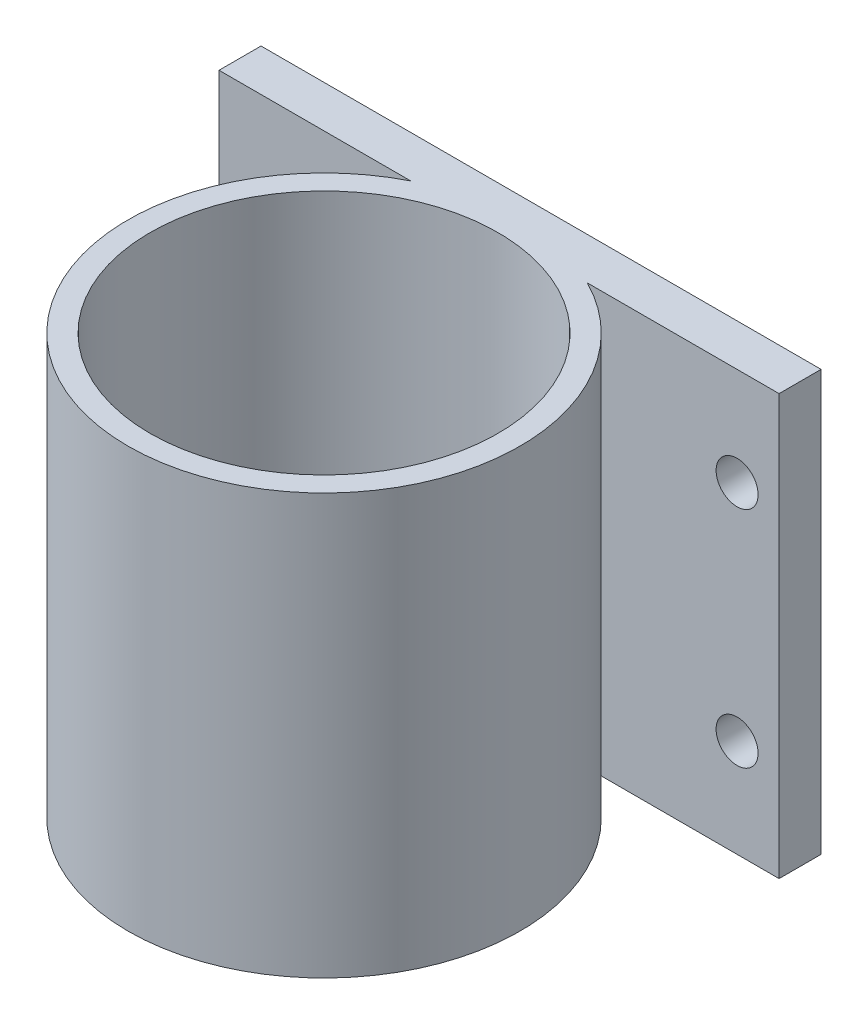
ISO-10303-21;
HEADER;
FILE_DESCRIPTION(('STEP AP214'),'2;1');
FILE_NAME('part.step','',(''),(''),'','','');
FILE_SCHEMA(('AUTOMOTIVE_DESIGN { 1 0 10303 214 1 1 1 1 }'));
ENDSEC;
DATA;
#1=APPLICATION_CONTEXT('core data for automotive mechanical design processes');
#2=APPLICATION_PROTOCOL_DEFINITION('international standard','automotive_design',2000,#1);
#3=PRODUCT_CONTEXT('',#1,'mechanical');
#4=PRODUCT('Part','Part','',(#3));
#5=PRODUCT_RELATED_PRODUCT_CATEGORY('part','',(#4));
#6=PRODUCT_DEFINITION_FORMATION('','',#4);
#7=PRODUCT_DEFINITION_CONTEXT('part definition',#1,'design');
#8=PRODUCT_DEFINITION('design','',#6,#7);
#9=PRODUCT_DEFINITION_SHAPE('','',#8);
#10=(LENGTH_UNIT() NAMED_UNIT(*) SI_UNIT(.MILLI.,.METRE.));
#11=(NAMED_UNIT(*) PLANE_ANGLE_UNIT() SI_UNIT($,.RADIAN.));
#12=(NAMED_UNIT(*) SI_UNIT($,.STERADIAN.) SOLID_ANGLE_UNIT());
#13=UNCERTAINTY_MEASURE_WITH_UNIT(LENGTH_MEASURE(1.E-05),#10,'distance_accuracy_value','');
#14=(GEOMETRIC_REPRESENTATION_CONTEXT(3) GLOBAL_UNCERTAINTY_ASSIGNED_CONTEXT((#13)) GLOBAL_UNIT_ASSIGNED_CONTEXT((#10,
#11,#12)) REPRESENTATION_CONTEXT('',''));
#15=CARTESIAN_POINT('',(0.,0.,0.));
#16=DIRECTION('',(0.,0.,1.));
#17=DIRECTION('',(1.,0.,0.));
#18=AXIS2_PLACEMENT_3D('',#15,#16,#17);
#19=CARTESIAN_POINT('',(0.,30.,0.));
#20=DIRECTION('',(0.,1.,0.));
#21=DIRECTION('',(0.,0.,1.));
#22=AXIS2_PLACEMENT_3D('',#19,#20,#21);
#23=PLANE('',#22);
#24=CARTESIAN_POINT('',(0.,30.,0.));
#25=DIRECTION('',(0.,1.,0.));
#26=DIRECTION('',(0.,0.,1.));
#27=AXIS2_PLACEMENT_3D('',#24,#25,#26);
#28=CIRCLE('',#27,14.);
#29=CARTESIAN_POINT('',(-6.30476010645924,30.,-12.5));
#30=VERTEX_POINT('',#29);
#31=CARTESIAN_POINT('',(6.30476010645924,30.,-12.5));
#32=VERTEX_POINT('',#31);
#33=EDGE_CURVE('E59',#30,#32,#28,.T.);
#34=ORIENTED_EDGE('',*,*,#33,.T.);
#35=DIRECTION('',(-1.,0.,0.));
#36=VECTOR('',#35,1.);
#37=CARTESIAN_POINT('',(-20.,30.,-12.5));
#38=LINE('',#37,#36);
#39=CARTESIAN_POINT('',(20.,30.,-12.5));
#40=VERTEX_POINT('',#39);
#41=EDGE_CURVE('E94',#40,#32,#38,.T.);
#42=ORIENTED_EDGE('',*,*,#41,.F.);
#43=DIRECTION('',(0.,0.,1.));
#44=VECTOR('',#43,1.);
#45=CARTESIAN_POINT('',(20.,30.,-12.5));
#46=LINE('',#45,#44);
#47=CARTESIAN_POINT('',(20.,30.,-15.5));
#48=VERTEX_POINT('',#47);
#49=EDGE_CURVE('E108',#48,#40,#46,.T.);
#50=ORIENTED_EDGE('',*,*,#49,.F.);
#51=DIRECTION('',(1.,0.,0.));
#52=VECTOR('',#51,1.);
#53=CARTESIAN_POINT('',(-20.,30.,-15.5));
#54=LINE('',#53,#52);
#55=CARTESIAN_POINT('',(-20.,30.,-15.5));
#56=VERTEX_POINT('',#55);
#57=EDGE_CURVE('E102',#56,#48,#54,.T.);
#58=ORIENTED_EDGE('',*,*,#57,.F.);
#59=DIRECTION('',(0.,0.,-1.));
#60=VECTOR('',#59,1.);
#61=CARTESIAN_POINT('',(-20.,30.,-12.5));
#62=LINE('',#61,#60);
#63=CARTESIAN_POINT('',(-20.,30.,-12.5));
#64=VERTEX_POINT('',#63);
#65=EDGE_CURVE('E111',#64,#56,#62,.T.);
#66=ORIENTED_EDGE('',*,*,#65,.F.);
#67=EDGE_CURVE('E112',#30,#64,#38,.T.);
#68=ORIENTED_EDGE('',*,*,#67,.F.);
#69=EDGE_LOOP('',(#34,#42,#50,#58,#66,#68));
#70=FACE_BOUND('',#69,.T.);
#71=CARTESIAN_POINT('',(0.,30.,0.));
#72=DIRECTION('',(0.,1.,0.));
#73=DIRECTION('',(0.,0.,1.));
#74=AXIS2_PLACEMENT_3D('',#71,#72,#73);
#75=CIRCLE('',#74,12.425);
#76=CARTESIAN_POINT('',(0.,30.,12.425));
#77=VERTEX_POINT('',#76);
#78=EDGE_CURVE('E140',#77,#77,#75,.T.);
#79=ORIENTED_EDGE('',*,*,#78,.F.);
#80=EDGE_LOOP('',(#79));
#81=FACE_BOUND('',#80,.T.);
#82=ADVANCED_FACE('F38',(#70,#81),#23,.T.);
#83=CARTESIAN_POINT('',(0.,0.,0.));
#84=DIRECTION('',(0.,1.,0.));
#85=DIRECTION('',(0.,0.,1.));
#86=AXIS2_PLACEMENT_3D('',#83,#84,#85);
#87=PLANE('',#86);
#88=CARTESIAN_POINT('',(0.,0.,0.));
#89=DIRECTION('',(0.,1.,0.));
#90=DIRECTION('',(0.,0.,1.));
#91=AXIS2_PLACEMENT_3D('',#88,#89,#90);
#92=CIRCLE('',#91,14.);
#93=CARTESIAN_POINT('',(-6.30476010645924,0.,-12.5));
#94=VERTEX_POINT('',#93);
#95=CARTESIAN_POINT('',(6.30476010645924,0.,-12.5));
#96=VERTEX_POINT('',#95);
#97=EDGE_CURVE('E54',#94,#96,#92,.T.);
#98=ORIENTED_EDGE('',*,*,#97,.F.);
#99=DIRECTION('',(-1.,0.,0.));
#100=VECTOR('',#99,1.);
#101=CARTESIAN_POINT('',(-20.,0.,-12.5));
#102=LINE('',#101,#100);
#103=CARTESIAN_POINT('',(-20.,0.,-12.5));
#104=VERTEX_POINT('',#103);
#105=EDGE_CURVE('E130',#94,#104,#102,.T.);
#106=ORIENTED_EDGE('',*,*,#105,.T.);
#107=DIRECTION('',(0.,0.,-1.));
#108=VECTOR('',#107,1.);
#109=CARTESIAN_POINT('',(-20.,0.,-12.5));
#110=LINE('',#109,#108);
#111=CARTESIAN_POINT('',(-20.,0.,-15.5));
#112=VERTEX_POINT('',#111);
#113=EDGE_CURVE('E119',#104,#112,#110,.T.);
#114=ORIENTED_EDGE('',*,*,#113,.T.);
#115=DIRECTION('',(1.,0.,0.));
#116=VECTOR('',#115,1.);
#117=CARTESIAN_POINT('',(-20.,0.,-15.5));
#118=LINE('',#117,#116);
#119=CARTESIAN_POINT('',(20.,0.,-15.5));
#120=VERTEX_POINT('',#119);
#121=EDGE_CURVE('E116',#112,#120,#118,.T.);
#122=ORIENTED_EDGE('',*,*,#121,.T.);
#123=DIRECTION('',(0.,0.,1.));
#124=VECTOR('',#123,1.);
#125=CARTESIAN_POINT('',(20.,0.,-12.5));
#126=LINE('',#125,#124);
#127=CARTESIAN_POINT('',(20.,0.,-12.5));
#128=VERTEX_POINT('',#127);
#129=EDGE_CURVE('E128',#120,#128,#126,.T.);
#130=ORIENTED_EDGE('',*,*,#129,.T.);
#131=EDGE_CURVE('E96',#128,#96,#102,.T.);
#132=ORIENTED_EDGE('',*,*,#131,.T.);
#133=EDGE_LOOP('',(#98,#106,#114,#122,#130,#132));
#134=FACE_BOUND('',#133,.T.);
#135=CARTESIAN_POINT('',(0.,0.,0.));
#136=DIRECTION('',(0.,1.,0.));
#137=DIRECTION('',(0.,0.,1.));
#138=AXIS2_PLACEMENT_3D('',#135,#136,#137);
#139=CIRCLE('',#138,12.425);
#140=CARTESIAN_POINT('',(0.,0.,12.425));
#141=VERTEX_POINT('',#140);
#142=EDGE_CURVE('E135',#141,#141,#139,.T.);
#143=ORIENTED_EDGE('',*,*,#142,.T.);
#144=EDGE_LOOP('',(#143));
#145=FACE_BOUND('',#144,.T.);
#146=ADVANCED_FACE('F175',(#134,#145),#87,.F.);
#147=CARTESIAN_POINT('',(0.,30.,0.));
#148=DIRECTION('',(0.,-1.,0.));
#149=DIRECTION('',(0.,0.,-1.));
#150=AXIS2_PLACEMENT_3D('',#147,#148,#149);
#151=CYLINDRICAL_SURFACE('',#150,14.);
#152=ORIENTED_EDGE('',*,*,#33,.F.);
#153=DIRECTION('',(0.,-1.,0.));
#154=VECTOR('',#153,1.);
#155=CARTESIAN_POINT('',(-6.30476010645924,30.,-12.5));
#156=LINE('',#155,#154);
#157=EDGE_CURVE('E11',#30,#94,#156,.T.);
#158=ORIENTED_EDGE('',*,*,#157,.T.);
#159=ORIENTED_EDGE('',*,*,#97,.T.);
#160=DIRECTION('',(0.,-1.,0.));
#161=VECTOR('',#160,1.);
#162=CARTESIAN_POINT('',(6.30476010645924,30.,-12.5));
#163=LINE('',#162,#161);
#164=EDGE_CURVE('E47',#96,#32,#163,.F.);
#165=ORIENTED_EDGE('',*,*,#164,.T.);
#166=EDGE_LOOP('',(#152,#158,#159,#165));
#167=FACE_BOUND('',#166,.T.);
#168=ADVANCED_FACE('F40',(#167),#151,.T.);
#169=CARTESIAN_POINT('',(0.,30.,0.));
#170=DIRECTION('',(0.,-1.,0.));
#171=DIRECTION('',(0.,0.,-1.));
#172=AXIS2_PLACEMENT_3D('',#169,#170,#171);
#173=CYLINDRICAL_SURFACE('',#172,12.425);
#174=ORIENTED_EDGE('',*,*,#78,.T.);
#175=EDGE_LOOP('',(#174));
#176=FACE_BOUND('',#175,.T.);
#177=ORIENTED_EDGE('',*,*,#142,.F.);
#178=EDGE_LOOP('',(#177));
#179=FACE_BOUND('',#178,.T.);
#180=ADVANCED_FACE('F185',(#176,#179),#173,.F.);
#181=CARTESIAN_POINT('',(-20.,30.,-12.5));
#182=DIRECTION('',(0.,0.,1.));
#183=DIRECTION('',(1.,0.,0.));
#184=AXIS2_PLACEMENT_3D('',#181,#182,#183);
#185=PLANE('',#184);
#186=CARTESIAN_POINT('',(-17.,23.,-12.5));
#187=DIRECTION('',(0.,0.,1.));
#188=DIRECTION('',(1.,0.,0.));
#189=AXIS2_PLACEMENT_3D('',#186,#187,#188);
#190=CIRCLE('',#189,1.5);
#191=CARTESIAN_POINT('',(-15.5,23.,-12.5));
#192=VERTEX_POINT('',#191);
#193=EDGE_CURVE('E228',#192,#192,#190,.T.);
#194=ORIENTED_EDGE('',*,*,#193,.F.);
#195=EDGE_LOOP('',(#194));
#196=FACE_BOUND('',#195,.T.);
#197=CARTESIAN_POINT('',(-17.,7.,-12.5));
#198=DIRECTION('',(0.,0.,1.));
#199=DIRECTION('',(1.,0.,0.));
#200=AXIS2_PLACEMENT_3D('',#197,#198,#199);
#201=CIRCLE('',#200,1.5);
#202=CARTESIAN_POINT('',(-15.5,7.,-12.5));
#203=VERTEX_POINT('',#202);
#204=EDGE_CURVE('E223',#203,#203,#201,.T.);
#205=ORIENTED_EDGE('',*,*,#204,.F.);
#206=EDGE_LOOP('',(#205));
#207=FACE_BOUND('',#206,.T.);
#208=ORIENTED_EDGE('',*,*,#157,.F.);
#209=ORIENTED_EDGE('',*,*,#67,.T.);
#210=DIRECTION('',(0.,-1.,0.));
#211=VECTOR('',#210,1.);
#212=CARTESIAN_POINT('',(-20.,30.,-12.5));
#213=LINE('',#212,#211);
#214=EDGE_CURVE('E101',#64,#104,#213,.T.);
#215=ORIENTED_EDGE('',*,*,#214,.T.);
#216=ORIENTED_EDGE('',*,*,#105,.F.);
#217=EDGE_LOOP('',(#208,#209,#215,#216));
#218=FACE_BOUND('',#217,.T.);
#219=ADVANCED_FACE('F183',(#196,#207,#218),#185,.T.);
#220=CARTESIAN_POINT('',(17.,7.,-12.5));
#221=DIRECTION('',(0.,0.,1.));
#222=DIRECTION('',(1.,0.,0.));
#223=AXIS2_PLACEMENT_3D('',#220,#221,#222);
#224=CIRCLE('',#223,1.5);
#225=CARTESIAN_POINT('',(18.5,7.,-12.5));
#226=VERTEX_POINT('',#225);
#227=EDGE_CURVE('E225',#226,#226,#224,.T.);
#228=ORIENTED_EDGE('',*,*,#227,.F.);
#229=EDGE_LOOP('',(#228));
#230=FACE_BOUND('',#229,.T.);
#231=CARTESIAN_POINT('',(17.,23.,-12.5));
#232=DIRECTION('',(0.,0.,1.));
#233=DIRECTION('',(1.,0.,0.));
#234=AXIS2_PLACEMENT_3D('',#231,#232,#233);
#235=CIRCLE('',#234,1.5);
#236=CARTESIAN_POINT('',(18.5,23.,-12.5));
#237=VERTEX_POINT('',#236);
#238=EDGE_CURVE('E122',#237,#237,#235,.T.);
#239=ORIENTED_EDGE('',*,*,#238,.F.);
#240=EDGE_LOOP('',(#239));
#241=FACE_BOUND('',#240,.T.);
#242=ORIENTED_EDGE('',*,*,#164,.F.);
#243=ORIENTED_EDGE('',*,*,#131,.F.);
#244=DIRECTION('',(0.,-1.,0.));
#245=VECTOR('',#244,1.);
#246=CARTESIAN_POINT('',(20.,30.,-12.5));
#247=LINE('',#246,#245);
#248=EDGE_CURVE('E91',#40,#128,#247,.T.);
#249=ORIENTED_EDGE('',*,*,#248,.F.);
#250=ORIENTED_EDGE('',*,*,#41,.T.);
#251=EDGE_LOOP('',(#242,#243,#249,#250));
#252=FACE_BOUND('',#251,.T.);
#253=ADVANCED_FACE('F93',(#230,#241,#252),#185,.T.);
#254=CARTESIAN_POINT('',(20.,30.,-12.5));
#255=DIRECTION('',(1.,0.,0.));
#256=DIRECTION('',(0.,0.,-1.));
#257=AXIS2_PLACEMENT_3D('',#254,#255,#256);
#258=PLANE('',#257);
#259=ORIENTED_EDGE('',*,*,#129,.F.);
#260=DIRECTION('',(0.,-1.,0.));
#261=VECTOR('',#260,1.);
#262=CARTESIAN_POINT('',(20.,30.,-15.5));
#263=LINE('',#262,#261);
#264=EDGE_CURVE('E115',#48,#120,#263,.T.);
#265=ORIENTED_EDGE('',*,*,#264,.F.);
#266=ORIENTED_EDGE('',*,*,#49,.T.);
#267=ORIENTED_EDGE('',*,*,#248,.T.);
#268=EDGE_LOOP('',(#259,#265,#266,#267));
#269=FACE_BOUND('',#268,.T.);
#270=ADVANCED_FACE('F114',(#269),#258,.T.);
#271=CARTESIAN_POINT('',(-20.,30.,-15.5));
#272=DIRECTION('',(0.,0.,-1.));
#273=DIRECTION('',(-1.,0.,0.));
#274=AXIS2_PLACEMENT_3D('',#271,#272,#273);
#275=PLANE('',#274);
#276=CARTESIAN_POINT('',(-17.,23.,-15.5));
#277=DIRECTION('',(0.,0.,-1.));
#278=DIRECTION('',(-1.,0.,0.));
#279=AXIS2_PLACEMENT_3D('',#276,#277,#278);
#280=CIRCLE('',#279,1.5);
#281=CARTESIAN_POINT('',(-18.5,23.,-15.5));
#282=VERTEX_POINT('',#281);
#283=EDGE_CURVE('E42',#282,#282,#280,.T.);
#284=ORIENTED_EDGE('',*,*,#283,.F.);
#285=EDGE_LOOP('',(#284));
#286=FACE_BOUND('',#285,.T.);
#287=CARTESIAN_POINT('',(17.,7.,-15.5));
#288=DIRECTION('',(0.,0.,-1.));
#289=DIRECTION('',(-1.,0.,0.));
#290=AXIS2_PLACEMENT_3D('',#287,#288,#289);
#291=CIRCLE('',#290,1.5);
#292=CARTESIAN_POINT('',(15.5,7.,-15.5));
#293=VERTEX_POINT('',#292);
#294=EDGE_CURVE('E153',#293,#293,#291,.T.);
#295=ORIENTED_EDGE('',*,*,#294,.F.);
#296=EDGE_LOOP('',(#295));
#297=FACE_BOUND('',#296,.T.);
#298=CARTESIAN_POINT('',(-17.,7.,-15.5));
#299=DIRECTION('',(0.,0.,-1.));
#300=DIRECTION('',(-1.,0.,0.));
#301=AXIS2_PLACEMENT_3D('',#298,#299,#300);
#302=CIRCLE('',#301,1.5);
#303=CARTESIAN_POINT('',(-18.5,7.,-15.5));
#304=VERTEX_POINT('',#303);
#305=EDGE_CURVE('E151',#304,#304,#302,.T.);
#306=ORIENTED_EDGE('',*,*,#305,.F.);
#307=EDGE_LOOP('',(#306));
#308=FACE_BOUND('',#307,.T.);
#309=CARTESIAN_POINT('',(17.,23.,-15.5));
#310=DIRECTION('',(0.,0.,-1.));
#311=DIRECTION('',(-1.,0.,0.));
#312=AXIS2_PLACEMENT_3D('',#309,#310,#311);
#313=CIRCLE('',#312,1.5);
#314=CARTESIAN_POINT('',(15.5,23.,-15.5));
#315=VERTEX_POINT('',#314);
#316=EDGE_CURVE('E148',#315,#315,#313,.T.);
#317=ORIENTED_EDGE('',*,*,#316,.F.);
#318=EDGE_LOOP('',(#317));
#319=FACE_BOUND('',#318,.T.);
#320=ORIENTED_EDGE('',*,*,#121,.F.);
#321=DIRECTION('',(0.,-1.,0.));
#322=VECTOR('',#321,1.);
#323=CARTESIAN_POINT('',(-20.,30.,-15.5));
#324=LINE('',#323,#322);
#325=EDGE_CURVE('E136',#56,#112,#324,.T.);
#326=ORIENTED_EDGE('',*,*,#325,.F.);
#327=ORIENTED_EDGE('',*,*,#57,.T.);
#328=ORIENTED_EDGE('',*,*,#264,.T.);
#329=EDGE_LOOP('',(#320,#326,#327,#328));
#330=FACE_BOUND('',#329,.T.);
#331=ADVANCED_FACE('F163',(#286,#297,#308,#319,#330),#275,.T.);
#332=CARTESIAN_POINT('',(-20.,30.,-12.5));
#333=DIRECTION('',(-1.,0.,0.));
#334=DIRECTION('',(0.,0.,1.));
#335=AXIS2_PLACEMENT_3D('',#332,#333,#334);
#336=PLANE('',#335);
#337=ORIENTED_EDGE('',*,*,#113,.F.);
#338=ORIENTED_EDGE('',*,*,#214,.F.);
#339=ORIENTED_EDGE('',*,*,#65,.T.);
#340=ORIENTED_EDGE('',*,*,#325,.T.);
#341=EDGE_LOOP('',(#337,#338,#339,#340));
#342=FACE_BOUND('',#341,.T.);
#343=ADVANCED_FACE('F166',(#342),#336,.T.);
#344=CARTESIAN_POINT('',(17.,23.,-42.5));
#345=DIRECTION('',(0.,0.,1.));
#346=DIRECTION('',(1.,0.,0.));
#347=AXIS2_PLACEMENT_3D('',#344,#345,#346);
#348=CYLINDRICAL_SURFACE('',#347,1.5);
#349=ORIENTED_EDGE('',*,*,#316,.T.);
#350=EDGE_LOOP('',(#349));
#351=FACE_BOUND('',#350,.T.);
#352=ORIENTED_EDGE('',*,*,#238,.T.);
#353=EDGE_LOOP('',(#352));
#354=FACE_BOUND('',#353,.T.);
#355=ADVANCED_FACE('F205',(#351,#354),#348,.F.);
#356=CARTESIAN_POINT('',(-17.,7.,-42.5));
#357=DIRECTION('',(0.,0.,1.));
#358=DIRECTION('',(1.,0.,0.));
#359=AXIS2_PLACEMENT_3D('',#356,#357,#358);
#360=CYLINDRICAL_SURFACE('',#359,1.5);
#361=ORIENTED_EDGE('',*,*,#305,.T.);
#362=EDGE_LOOP('',(#361));
#363=FACE_BOUND('',#362,.T.);
#364=ORIENTED_EDGE('',*,*,#204,.T.);
#365=EDGE_LOOP('',(#364));
#366=FACE_BOUND('',#365,.T.);
#367=ADVANCED_FACE('F209',(#363,#366),#360,.F.);
#368=CARTESIAN_POINT('',(17.,7.,-42.5));
#369=DIRECTION('',(0.,0.,1.));
#370=DIRECTION('',(1.,0.,0.));
#371=AXIS2_PLACEMENT_3D('',#368,#369,#370);
#372=CYLINDRICAL_SURFACE('',#371,1.5);
#373=ORIENTED_EDGE('',*,*,#294,.T.);
#374=EDGE_LOOP('',(#373));
#375=FACE_BOUND('',#374,.T.);
#376=ORIENTED_EDGE('',*,*,#227,.T.);
#377=EDGE_LOOP('',(#376));
#378=FACE_BOUND('',#377,.T.);
#379=ADVANCED_FACE('F211',(#375,#378),#372,.F.);
#380=CARTESIAN_POINT('',(-17.,23.,-42.5));
#381=DIRECTION('',(0.,0.,1.));
#382=DIRECTION('',(1.,0.,0.));
#383=AXIS2_PLACEMENT_3D('',#380,#381,#382);
#384=CYLINDRICAL_SURFACE('',#383,1.5);
#385=ORIENTED_EDGE('',*,*,#283,.T.);
#386=EDGE_LOOP('',(#385));
#387=FACE_BOUND('',#386,.T.);
#388=ORIENTED_EDGE('',*,*,#193,.T.);
#389=EDGE_LOOP('',(#388));
#390=FACE_BOUND('',#389,.T.);
#391=ADVANCED_FACE('F160',(#387,#390),#384,.F.);
#392=CLOSED_SHELL('',(#82,#146,#168,#180,#219,#253,#270,#331,#343,#355,#367,#379,#391));
#393=MANIFOLD_SOLID_BREP('B2',#392);
#394=ADVANCED_BREP_SHAPE_REPRESENTATION('',(#18,#393),#14);
#395=SHAPE_DEFINITION_REPRESENTATION(#9,#394);
ENDSEC;
END-ISO-10303-21;
